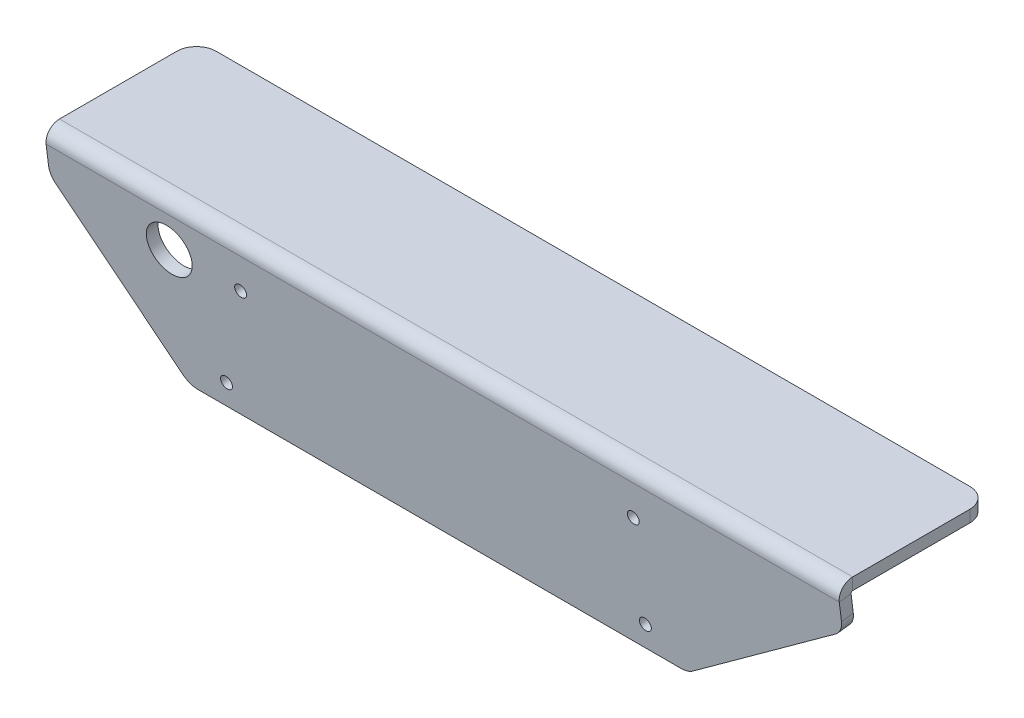
ISO-10303-21;
HEADER;
FILE_DESCRIPTION(('STEP AP214'),'2;1');
FILE_NAME('part.step','',(''),(''),'','','');
FILE_SCHEMA(('AUTOMOTIVE_DESIGN { 1 0 10303 214 1 1 1 1 }'));
ENDSEC;
DATA;
#1=APPLICATION_CONTEXT('core data for automotive mechanical design processes');
#2=APPLICATION_PROTOCOL_DEFINITION('international standard','automotive_design',2000,#1);
#3=PRODUCT_CONTEXT('',#1,'mechanical');
#4=PRODUCT('Part','Part','',(#3));
#5=PRODUCT_RELATED_PRODUCT_CATEGORY('part','',(#4));
#6=PRODUCT_DEFINITION_FORMATION('','',#4);
#7=PRODUCT_DEFINITION_CONTEXT('part definition',#1,'design');
#8=PRODUCT_DEFINITION('design','',#6,#7);
#9=PRODUCT_DEFINITION_SHAPE('','',#8);
#10=(LENGTH_UNIT() NAMED_UNIT(*) SI_UNIT(.MILLI.,.METRE.));
#11=(NAMED_UNIT(*) PLANE_ANGLE_UNIT() SI_UNIT($,.RADIAN.));
#12=(NAMED_UNIT(*) SI_UNIT($,.STERADIAN.) SOLID_ANGLE_UNIT());
#13=UNCERTAINTY_MEASURE_WITH_UNIT(LENGTH_MEASURE(1.E-05),#10,'distance_accuracy_value','');
#14=(GEOMETRIC_REPRESENTATION_CONTEXT(3) GLOBAL_UNCERTAINTY_ASSIGNED_CONTEXT((#13)) GLOBAL_UNIT_ASSIGNED_CONTEXT((#10,
#11,#12)) REPRESENTATION_CONTEXT('',''));
#15=CARTESIAN_POINT('',(0.,0.,0.));
#16=DIRECTION('',(0.,0.,1.));
#17=DIRECTION('',(1.,0.,0.));
#18=AXIS2_PLACEMENT_3D('',#15,#16,#17);
#19=CARTESIAN_POINT('',(0.,50.,40.));
#20=DIRECTION('',(1.,0.,0.));
#21=DIRECTION('',(0.,0.,-1.));
#22=AXIS2_PLACEMENT_3D('',#19,#20,#21);
#23=PLANE('',#22);
#24=DIRECTION('',(0.,-1.,0.));
#25=VECTOR('',#24,1.);
#26=CARTESIAN_POINT('',(0.,50.,39.0957644909106));
#27=LINE('',#26,#25);
#28=CARTESIAN_POINT('',(0.,56.,39.0957644909106));
#29=VERTEX_POINT('',#28);
#30=CARTESIAN_POINT('',(0.,50.,39.0957644909106));
#31=VERTEX_POINT('',#30);
#32=EDGE_CURVE('E11',#29,#31,#27,.T.);
#33=ORIENTED_EDGE('',*,*,#32,.F.);
#34=DIRECTION('',(0.,0.,1.));
#35=VECTOR('',#34,1.);
#36=CARTESIAN_POINT('',(0.,56.,40.));
#37=LINE('',#36,#35);
#38=CARTESIAN_POINT('',(0.,56.,-20.));
#39=VERTEX_POINT('',#38);
#40=EDGE_CURVE('E108',#29,#39,#37,.F.);
#41=ORIENTED_EDGE('',*,*,#40,.T.);
#42=DIRECTION('',(0.,-1.,0.));
#43=VECTOR('',#42,1.);
#44=CARTESIAN_POINT('',(0.,50.,-20.));
#45=LINE('',#44,#43);
#46=CARTESIAN_POINT('',(0.,50.,-20.));
#47=VERTEX_POINT('',#46);
#48=EDGE_CURVE('E45',#39,#47,#45,.T.);
#49=ORIENTED_EDGE('',*,*,#48,.T.);
#50=DIRECTION('',(0.,0.,-1.));
#51=VECTOR('',#50,1.);
#52=CARTESIAN_POINT('',(0.,50.,40.));
#53=LINE('',#52,#51);
#54=EDGE_CURVE('E110',#31,#47,#53,.T.);
#55=ORIENTED_EDGE('',*,*,#54,.F.);
#56=EDGE_LOOP('',(#33,#41,#49,#55));
#57=FACE_BOUND('',#56,.T.);
#58=ADVANCED_FACE('F35',(#57),#23,.F.);
#59=CARTESIAN_POINT('',(10.,50.,-20.));
#60=DIRECTION('',(0.,1.,0.));
#61=DIRECTION('',(0.,0.,1.));
#62=AXIS2_PLACEMENT_3D('',#59,#60,#61);
#63=CYLINDRICAL_SURFACE('',#62,10.);
#64=ORIENTED_EDGE('',*,*,#48,.F.);
#65=CARTESIAN_POINT('',(10.,56.,-20.));
#66=DIRECTION('',(0.,1.,0.));
#67=DIRECTION('',(0.,0.,1.));
#68=AXIS2_PLACEMENT_3D('',#65,#66,#67);
#69=CIRCLE('',#68,10.);
#70=CARTESIAN_POINT('',(10.,56.,-30.));
#71=VERTEX_POINT('',#70);
#72=EDGE_CURVE('E135',#39,#71,#69,.F.);
#73=ORIENTED_EDGE('',*,*,#72,.T.);
#74=DIRECTION('',(0.,-1.,0.));
#75=VECTOR('',#74,1.);
#76=CARTESIAN_POINT('',(10.,50.,-30.));
#77=LINE('',#76,#75);
#78=CARTESIAN_POINT('',(10.,50.,-30.));
#79=VERTEX_POINT('',#78);
#80=EDGE_CURVE('E179',#71,#79,#77,.T.);
#81=ORIENTED_EDGE('',*,*,#80,.T.);
#82=CARTESIAN_POINT('',(10.,50.,-20.));
#83=DIRECTION('',(0.,1.,0.));
#84=DIRECTION('',(0.,0.,1.));
#85=AXIS2_PLACEMENT_3D('',#82,#83,#84);
#86=CIRCLE('',#85,10.);
#87=EDGE_CURVE('E193',#47,#79,#86,.F.);
#88=ORIENTED_EDGE('',*,*,#87,.F.);
#89=EDGE_LOOP('',(#64,#73,#81,#88));
#90=FACE_BOUND('',#89,.T.);
#91=ADVANCED_FACE('F199',(#90),#63,.T.);
#92=CARTESIAN_POINT('',(400.,50.,-30.));
#93=DIRECTION('',(0.,0.,-1.));
#94=DIRECTION('',(-1.,0.,0.));
#95=AXIS2_PLACEMENT_3D('',#92,#93,#94);
#96=PLANE('',#95);
#97=ORIENTED_EDGE('',*,*,#80,.F.);
#98=DIRECTION('',(1.,0.,0.));
#99=VECTOR('',#98,1.);
#100=CARTESIAN_POINT('',(400.,56.,-30.));
#101=LINE('',#100,#99);
#102=CARTESIAN_POINT('',(390.,56.,-30.));
#103=VERTEX_POINT('',#102);
#104=EDGE_CURVE('E140',#103,#71,#101,.F.);
#105=ORIENTED_EDGE('',*,*,#104,.F.);
#106=DIRECTION('',(0.,-1.,0.));
#107=VECTOR('',#106,1.);
#108=CARTESIAN_POINT('',(390.,50.,-30.));
#109=LINE('',#108,#107);
#110=CARTESIAN_POINT('',(390.,50.,-30.));
#111=VERTEX_POINT('',#110);
#112=EDGE_CURVE('E176',#103,#111,#109,.T.);
#113=ORIENTED_EDGE('',*,*,#112,.T.);
#114=DIRECTION('',(-1.,0.,0.));
#115=VECTOR('',#114,1.);
#116=CARTESIAN_POINT('',(400.,50.,-30.));
#117=LINE('',#116,#115);
#118=EDGE_CURVE('E254',#111,#79,#117,.T.);
#119=ORIENTED_EDGE('',*,*,#118,.T.);
#120=EDGE_LOOP('',(#97,#105,#113,#119));
#121=FACE_BOUND('',#120,.T.);
#122=ADVANCED_FACE('F303',(#121),#96,.T.);
#123=CARTESIAN_POINT('',(390.,50.,-20.));
#124=DIRECTION('',(0.,1.,0.));
#125=DIRECTION('',(0.,0.,1.));
#126=AXIS2_PLACEMENT_3D('',#123,#124,#125);
#127=CYLINDRICAL_SURFACE('',#126,10.);
#128=ORIENTED_EDGE('',*,*,#112,.F.);
#129=CARTESIAN_POINT('',(390.,56.,-20.));
#130=DIRECTION('',(0.,1.,0.));
#131=DIRECTION('',(0.,0.,1.));
#132=AXIS2_PLACEMENT_3D('',#129,#130,#131);
#133=CIRCLE('',#132,10.);
#134=CARTESIAN_POINT('',(400.,56.,-20.));
#135=VERTEX_POINT('',#134);
#136=EDGE_CURVE('E297',#103,#135,#133,.F.);
#137=ORIENTED_EDGE('',*,*,#136,.T.);
#138=DIRECTION('',(0.,-1.,0.));
#139=VECTOR('',#138,1.);
#140=CARTESIAN_POINT('',(400.,50.,-20.));
#141=LINE('',#140,#139);
#142=CARTESIAN_POINT('',(400.,50.,-20.));
#143=VERTEX_POINT('',#142);
#144=EDGE_CURVE('E173',#135,#143,#141,.T.);
#145=ORIENTED_EDGE('',*,*,#144,.T.);
#146=CARTESIAN_POINT('',(390.,50.,-20.));
#147=DIRECTION('',(0.,1.,0.));
#148=DIRECTION('',(0.,0.,1.));
#149=AXIS2_PLACEMENT_3D('',#146,#147,#148);
#150=CIRCLE('',#149,10.);
#151=EDGE_CURVE('E309',#111,#143,#150,.F.);
#152=ORIENTED_EDGE('',*,*,#151,.F.);
#153=EDGE_LOOP('',(#128,#137,#145,#152));
#154=FACE_BOUND('',#153,.T.);
#155=ADVANCED_FACE('F395',(#154),#127,.T.);
#156=CARTESIAN_POINT('',(400.,50.,40.));
#157=DIRECTION('',(1.,0.,0.));
#158=DIRECTION('',(0.,0.,-1.));
#159=AXIS2_PLACEMENT_3D('',#156,#157,#158);
#160=PLANE('',#159);
#161=ORIENTED_EDGE('',*,*,#144,.F.);
#162=DIRECTION('',(0.,0.,1.));
#163=VECTOR('',#162,1.);
#164=CARTESIAN_POINT('',(400.,56.,40.));
#165=LINE('',#164,#163);
#166=CARTESIAN_POINT('',(400.,56.,39.0957644909106));
#167=VERTEX_POINT('',#166);
#168=EDGE_CURVE('E136',#167,#135,#165,.F.);
#169=ORIENTED_EDGE('',*,*,#168,.F.);
#170=DIRECTION('',(0.,-1.,0.));
#171=VECTOR('',#170,1.);
#172=CARTESIAN_POINT('',(400.,50.,39.0957644909106));
#173=LINE('',#172,#171);
#174=CARTESIAN_POINT('',(400.,50.,39.0957644909106));
#175=VERTEX_POINT('',#174);
#176=EDGE_CURVE('E170',#167,#175,#173,.T.);
#177=ORIENTED_EDGE('',*,*,#176,.T.);
#178=DIRECTION('',(0.,0.,-1.));
#179=VECTOR('',#178,1.);
#180=CARTESIAN_POINT('',(400.,50.,40.));
#181=LINE('',#180,#179);
#182=EDGE_CURVE('E197',#175,#143,#181,.T.);
#183=ORIENTED_EDGE('',*,*,#182,.T.);
#184=EDGE_LOOP('',(#161,#169,#177,#183));
#185=FACE_BOUND('',#184,.T.);
#186=ADVANCED_FACE('F314',(#185),#160,.T.);
#187=CARTESIAN_POINT('',(400.,49.2,39.0957644909106));
#188=DIRECTION('',(1.,0.,0.));
#189=DIRECTION('',(0.,0.,-1.));
#190=AXIS2_PLACEMENT_3D('',#187,#188,#189);
#191=PLANE('',#190);
#192=ORIENTED_EDGE('',*,*,#176,.F.);
#193=CARTESIAN_POINT('',(400.,49.2,39.0957644909106));
#194=DIRECTION('',(1.,0.,0.));
#195=DIRECTION('',(0.,0.,-1.));
#196=AXIS2_PLACEMENT_3D('',#193,#194,#195);
#197=CIRCLE('',#196,6.8);
#198=CARTESIAN_POINT('',(400.,48.3712884648451,45.8450783220716));
#199=VERTEX_POINT('',#198);
#200=EDGE_CURVE('E124',#167,#199,#197,.T.);
#201=ORIENTED_EDGE('',*,*,#200,.T.);
#202=DIRECTION('',(0.,0.121869343405152,-0.992546151641322));
#203=VECTOR('',#202,1.);
#204=CARTESIAN_POINT('',(400.,49.1025045252759,39.8898014122237));
#205=LINE('',#204,#203);
#206=CARTESIAN_POINT('',(400.,49.1025045252759,39.8898014122237));
#207=VERTEX_POINT('',#206);
#208=EDGE_CURVE('E168',#199,#207,#205,.T.);
#209=ORIENTED_EDGE('',*,*,#208,.T.);
#210=CARTESIAN_POINT('',(400.,49.2,39.0957644909106));
#211=DIRECTION('',(-1.,0.,0.));
#212=DIRECTION('',(0.,0.,1.));
#213=AXIS2_PLACEMENT_3D('',#210,#211,#212);
#214=CIRCLE('',#213,0.8);
#215=EDGE_CURVE('E251',#175,#207,#214,.F.);
#216=ORIENTED_EDGE('',*,*,#215,.F.);
#217=EDGE_LOOP('',(#192,#201,#209,#216));
#218=FACE_BOUND('',#217,.T.);
#219=ADVANCED_FACE('F321',(#218),#191,.T.);
#220=CARTESIAN_POINT('',(400.,-29.4036921313057,30.2504525275879));
#221=DIRECTION('',(1.,0.,0.));
#222=DIRECTION('',(0.,0.992546151641322,0.121869343405152));
#223=AXIS2_PLACEMENT_3D('',#220,#221,#222);
#224=PLANE('',#223);
#225=ORIENTED_EDGE('',*,*,#208,.F.);
#226=DIRECTION('',(0.,-0.992546151641322,-0.121869343405152));
#227=VECTOR('',#226,1.);
#228=CARTESIAN_POINT('',(400.,-30.1349081917366,36.2057294374358));
#229=LINE('',#228,#227);
#230=CARTESIAN_POINT('',(400.,39.3203256034525,44.733759821387));
#231=VERTEX_POINT('',#230);
#232=EDGE_CURVE('E271',#231,#199,#229,.F.);
#233=ORIENTED_EDGE('',*,*,#232,.F.);
#234=DIRECTION('',(0.,0.121869343405152,-0.992546151641322));
#235=VECTOR('',#234,1.);
#236=CARTESIAN_POINT('',(400.,40.0515416638834,38.7784829115391));
#237=LINE('',#236,#235);
#238=CARTESIAN_POINT('',(400.,40.0515416638834,38.7784829115391));
#239=VERTEX_POINT('',#238);
#240=EDGE_CURVE('E165',#231,#239,#237,.T.);
#241=ORIENTED_EDGE('',*,*,#240,.T.);
#242=DIRECTION('',(0.,0.992546151641322,0.121869343405152));
#243=VECTOR('',#242,1.);
#244=CARTESIAN_POINT('',(400.,-29.4036921313057,30.2504525275879));
#245=LINE('',#244,#243);
#246=EDGE_CURVE('E218',#239,#207,#245,.T.);
#247=ORIENTED_EDGE('',*,*,#246,.T.);
#248=EDGE_LOOP('',(#225,#233,#241,#247));
#249=FACE_BOUND('',#248,.T.);
#250=ADVANCED_FACE('F348',(#249),#224,.T.);
#251=CARTESIAN_POINT('',(390.,40.0515416638834,38.7784829115391));
#252=DIRECTION('',(0.,-0.121869343405152,0.992546151641322));
#253=DIRECTION('',(0.,-0.992546151641322,-0.121869343405152));
#254=AXIS2_PLACEMENT_3D('',#251,#252,#253);
#255=CYLINDRICAL_SURFACE('',#254,10.);
#256=ORIENTED_EDGE('',*,*,#240,.F.);
#257=CARTESIAN_POINT('',(390.,39.3203256034525,44.733759821387));
#258=DIRECTION('',(0.,-0.121869343405152,0.992546151641322));
#259=DIRECTION('',(0.,-0.992546151641322,-0.121869343405152));
#260=AXIS2_PLACEMENT_3D('',#257,#258,#259);
#261=CIRCLE('',#260,10.);
#262=CARTESIAN_POINT('',(396.029643092084,31.4021084030464,43.7615249993013));
#263=VERTEX_POINT('',#262);
#264=EDGE_CURVE('E291',#231,#263,#261,.F.);
#265=ORIENTED_EDGE('',*,*,#264,.T.);
#266=DIRECTION('',(0.,0.121869343405152,-0.992546151641322));
#267=VECTOR('',#266,1.);
#268=CARTESIAN_POINT('',(396.029643092084,32.1333244634773,37.8062480894533));
#269=LINE('',#268,#267);
#270=CARTESIAN_POINT('',(396.029643092084,32.1333244634773,37.8062480894533));
#271=VERTEX_POINT('',#270);
#272=EDGE_CURVE('E162',#263,#271,#269,.T.);
#273=ORIENTED_EDGE('',*,*,#272,.T.);
#274=CARTESIAN_POINT('',(390.,40.0515416638834,38.7784829115391));
#275=DIRECTION('',(0.,-0.121869343405152,0.992546151641322));
#276=DIRECTION('',(0.,-0.992546151641322,-0.121869343405152));
#277=AXIS2_PLACEMENT_3D('',#274,#275,#276);
#278=CIRCLE('',#277,10.);
#279=EDGE_CURVE('E221',#239,#271,#278,.F.);
#280=ORIENTED_EDGE('',*,*,#279,.F.);
#281=EDGE_LOOP('',(#256,#265,#273,#280));
#282=FACE_BOUND('',#281,.T.);
#283=ADVANCED_FACE('F353',(#282),#255,.T.);
#284=CARTESIAN_POINT('',(368.733327596592,11.6561682025768,35.2919694494184));
#285=DIRECTION('',(-0.602964309208396,0.791821720040617,0.0972234822085731));
#286=DIRECTION('',(-0.797768162952647,-0.598469904681862,-0.073482864459968));
#287=AXIS2_PLACEMENT_3D('',#284,#285,#286);
#288=PLANE('',#287);
#289=ORIENTED_EDGE('',*,*,#272,.F.);
#290=DIRECTION('',(-0.797768162952647,-0.598469904681862,-0.073482864459968));
#291=VECTOR('',#290,1.);
#292=CARTESIAN_POINT('',(368.733327596592,10.9249521421459,41.2472463592664));
#293=LINE('',#292,#291);
#294=CARTESIAN_POINT('',(316.675682767088,-28.1276638757296,36.4521880494016));
#295=VERTEX_POINT('',#294);
#296=EDGE_CURVE('E288',#263,#295,#293,.T.);
#297=ORIENTED_EDGE('',*,*,#296,.T.);
#298=DIRECTION('',(0.,0.121869343405152,-0.992546151641322));
#299=VECTOR('',#298,1.);
#300=CARTESIAN_POINT('',(316.675682767088,-27.3964478152987,30.4969111395537));
#301=LINE('',#300,#299);
#302=CARTESIAN_POINT('',(316.675682767088,-27.3964478152987,30.4969111395537));
#303=VERTEX_POINT('',#302);
#304=EDGE_CURVE('E159',#295,#303,#301,.T.);
#305=ORIENTED_EDGE('',*,*,#304,.T.);
#306=DIRECTION('',(-0.797768162952647,-0.598469904681862,-0.073482864459968));
#307=VECTOR('',#306,1.);
#308=CARTESIAN_POINT('',(368.733327596592,11.6561682025768,35.2919694494184));
#309=LINE('',#308,#307);
#310=EDGE_CURVE('E224',#271,#303,#309,.T.);
#311=ORIENTED_EDGE('',*,*,#310,.F.);
#312=EDGE_LOOP('',(#289,#297,#305,#311));
#313=FACE_BOUND('',#312,.T.);
#314=ADVANCED_FACE('F356',(#313),#288,.F.);
#315=CARTESIAN_POINT('',(310.646039675004,-19.4782306148925,31.4691459616394));
#316=DIRECTION('',(0.,-0.121869343405152,0.992546151641322));
#317=DIRECTION('',(0.,-0.992546151641322,-0.121869343405152));
#318=AXIS2_PLACEMENT_3D('',#315,#316,#317);
#319=CYLINDRICAL_SURFACE('',#318,10.);
#320=ORIENTED_EDGE('',*,*,#304,.F.);
#321=CARTESIAN_POINT('',(310.646039675004,-20.2094466753234,37.4244228714873));
#322=DIRECTION('',(0.,-0.121869343405152,0.992546151641322));
#323=DIRECTION('',(0.,-0.992546151641322,-0.121869343405152));
#324=AXIS2_PLACEMENT_3D('',#321,#322,#323);
#325=CIRCLE('',#324,10.);
#326=CARTESIAN_POINT('',(310.646039675004,-30.1349081917366,36.2057294374358));
#327=VERTEX_POINT('',#326);
#328=EDGE_CURVE('E285',#295,#327,#325,.F.);
#329=ORIENTED_EDGE('',*,*,#328,.T.);
#330=DIRECTION('',(0.,0.121869343405152,-0.992546151641322));
#331=VECTOR('',#330,1.);
#332=CARTESIAN_POINT('',(310.646039675004,-29.4036921313057,30.2504525275879));
#333=LINE('',#332,#331);
#334=CARTESIAN_POINT('',(310.646039675004,-29.4036921313057,30.2504525275879));
#335=VERTEX_POINT('',#334);
#336=EDGE_CURVE('E156',#327,#335,#333,.T.);
#337=ORIENTED_EDGE('',*,*,#336,.T.);
#338=CARTESIAN_POINT('',(310.646039675004,-19.4782306148925,31.4691459616394));
#339=DIRECTION('',(0.,-0.121869343405152,0.992546151641322));
#340=DIRECTION('',(0.,-0.992546151641322,-0.121869343405152));
#341=AXIS2_PLACEMENT_3D('',#338,#339,#340);
#342=CIRCLE('',#341,10.);
#343=EDGE_CURVE('E227',#303,#335,#342,.F.);
#344=ORIENTED_EDGE('',*,*,#343,.F.);
#345=EDGE_LOOP('',(#320,#329,#337,#344));
#346=FACE_BOUND('',#345,.T.);
#347=ADVANCED_FACE('F364',(#346),#319,.T.);
#348=CARTESIAN_POINT('',(400.,-29.4036921313057,30.2504525275879));
#349=DIRECTION('',(0.,0.992546151641322,0.121869343405152));
#350=DIRECTION('',(-1.,0.,0.));
#351=AXIS2_PLACEMENT_3D('',#348,#349,#350);
#352=PLANE('',#351);
#353=ORIENTED_EDGE('',*,*,#336,.F.);
#354=DIRECTION('',(1.,0.,0.));
#355=VECTOR('',#354,1.);
#356=CARTESIAN_POINT('',(400.,-30.1349081917366,36.2057294374358));
#357=LINE('',#356,#355);
#358=CARTESIAN_POINT('',(67.0337980422617,-30.1349081917366,36.2057294374358));
#359=VERTEX_POINT('',#358);
#360=EDGE_CURVE('E282',#327,#359,#357,.F.);
#361=ORIENTED_EDGE('',*,*,#360,.T.);
#362=DIRECTION('',(0.,0.121869343405152,-0.992546151641322));
#363=VECTOR('',#362,1.);
#364=CARTESIAN_POINT('',(67.0337980422617,-29.4036921313057,30.2504525275879));
#365=LINE('',#364,#363);
#366=CARTESIAN_POINT('',(67.0337980422617,-29.4036921313057,30.2504525275879));
#367=VERTEX_POINT('',#366);
#368=EDGE_CURVE('E153',#359,#367,#365,.T.);
#369=ORIENTED_EDGE('',*,*,#368,.T.);
#370=DIRECTION('',(-1.,0.,0.));
#371=VECTOR('',#370,1.);
#372=CARTESIAN_POINT('',(400.,-29.4036921313057,30.2504525275879));
#373=LINE('',#372,#371);
#374=EDGE_CURVE('E230',#335,#367,#373,.T.);
#375=ORIENTED_EDGE('',*,*,#374,.F.);
#376=EDGE_LOOP('',(#353,#361,#369,#375));
#377=FACE_BOUND('',#376,.T.);
#378=ADVANCED_FACE('F369',(#377),#352,.F.);
#379=CARTESIAN_POINT('',(67.0337980422617,-19.4782306148925,31.4691459616394));
#380=DIRECTION('',(0.,-0.121869343405152,0.992546151641322));
#381=DIRECTION('',(0.,-0.992546151641322,-0.121869343405152));
#382=AXIS2_PLACEMENT_3D('',#379,#380,#381);
#383=CYLINDRICAL_SURFACE('',#382,10.);
#384=ORIENTED_EDGE('',*,*,#368,.F.);
#385=CARTESIAN_POINT('',(67.0337980422617,-20.2094466753234,37.4244228714873));
#386=DIRECTION('',(0.,-0.121869343405152,0.992546151641322));
#387=DIRECTION('',(0.,-0.992546151641322,-0.121869343405152));
#388=AXIS2_PLACEMENT_3D('',#385,#386,#387);
#389=CIRCLE('',#388,10.);
#390=CARTESIAN_POINT('',(59.8415186596037,-27.1054011445351,36.5777061299787));
#391=VERTEX_POINT('',#390);
#392=EDGE_CURVE('E279',#359,#391,#389,.F.);
#393=ORIENTED_EDGE('',*,*,#392,.T.);
#394=DIRECTION('',(0.,0.121869343405152,-0.992546151641322));
#395=VECTOR('',#394,1.);
#396=CARTESIAN_POINT('',(59.8415186596037,-26.3741850841042,30.6224292201308));
#397=LINE('',#396,#395);
#398=CARTESIAN_POINT('',(59.8415186596037,-26.3741850841042,30.6224292201308));
#399=VERTEX_POINT('',#398);
#400=EDGE_CURVE('E150',#391,#399,#397,.T.);
#401=ORIENTED_EDGE('',*,*,#400,.T.);
#402=CARTESIAN_POINT('',(67.0337980422617,-19.4782306148925,31.4691459616394));
#403=DIRECTION('',(0.,-0.121869343405152,0.992546151641322));
#404=DIRECTION('',(0.,-0.992546151641322,-0.121869343405152));
#405=AXIS2_PLACEMENT_3D('',#402,#403,#404);
#406=CIRCLE('',#405,10.);
#407=EDGE_CURVE('E233',#367,#399,#406,.F.);
#408=ORIENTED_EDGE('',*,*,#407,.F.);
#409=EDGE_LOOP('',(#384,#393,#401,#408));
#410=FACE_BOUND('',#409,.T.);
#411=ADVANCED_FACE('F371',(#410),#383,.T.);
#412=CARTESIAN_POINT('',(225.565034585931,-196.651864141191,9.71495916554002));
#413=DIRECTION('',(0.719227938265804,0.689595446921172,0.0846716741508612));
#414=DIRECTION('',(-0.694774188364767,0.713866922278646,0.0876518365950944));
#415=AXIS2_PLACEMENT_3D('',#412,#413,#414);
#416=PLANE('',#415);
#417=ORIENTED_EDGE('',*,*,#400,.F.);
#418=DIRECTION('',(-0.694774188364767,0.713866922278646,0.0876518365950944));
#419=VECTOR('',#418,1.);
#420=CARTESIAN_POINT('',(225.565034585931,-197.383080201622,15.670236075388));
#421=LINE('',#420,#419);
#422=CARTESIAN_POINT('',(2.80772061734197,31.4957135141969,43.7730182617722));
#423=VERTEX_POINT('',#422);
#424=EDGE_CURVE('E276',#391,#423,#421,.T.);
#425=ORIENTED_EDGE('',*,*,#424,.T.);
#426=DIRECTION('',(0.,0.121869343405152,-0.992546151641322));
#427=VECTOR('',#426,1.);
#428=CARTESIAN_POINT('',(2.80772061734197,32.2269295746278,37.8177413519242));
#429=LINE('',#428,#427);
#430=CARTESIAN_POINT('',(2.80772061734197,32.2269295746278,37.8177413519242));
#431=VERTEX_POINT('',#430);
#432=EDGE_CURVE('E147',#423,#431,#429,.T.);
#433=ORIENTED_EDGE('',*,*,#432,.T.);
#434=DIRECTION('',(-0.694774188364767,0.713866922278646,0.0876518365950944));
#435=VECTOR('',#434,1.);
#436=CARTESIAN_POINT('',(225.565034585931,-196.651864141191,9.71495916554002));
#437=LINE('',#436,#435);
#438=EDGE_CURVE('E236',#399,#431,#437,.T.);
#439=ORIENTED_EDGE('',*,*,#438,.F.);
#440=EDGE_LOOP('',(#417,#425,#433,#439));
#441=FACE_BOUND('',#440,.T.);
#442=ADVANCED_FACE('F375',(#441),#416,.F.);
#443=CARTESIAN_POINT('',(10.,39.1228840438396,38.6644580934328));
#444=DIRECTION('',(0.,-0.121869343405152,0.992546151641322));
#445=DIRECTION('',(0.,-0.992546151641322,-0.121869343405152));
#446=AXIS2_PLACEMENT_3D('',#443,#444,#445);
#447=CYLINDRICAL_SURFACE('',#446,10.);
#448=ORIENTED_EDGE('',*,*,#432,.F.);
#449=CARTESIAN_POINT('',(10.,38.3916679834087,44.6197350032808));
#450=DIRECTION('',(0.,-0.121869343405152,0.992546151641322));
#451=DIRECTION('',(0.,-0.992546151641322,-0.121869343405152));
#452=AXIS2_PLACEMENT_3D('',#449,#450,#451);
#453=CIRCLE('',#452,10.);
#454=CARTESIAN_POINT('',(0.,38.3916679834087,44.6197350032808));
#455=VERTEX_POINT('',#454);
#456=EDGE_CURVE('E273',#423,#455,#453,.F.);
#457=ORIENTED_EDGE('',*,*,#456,.T.);
#458=DIRECTION('',(0.,0.121869343405152,-0.992546151641322));
#459=VECTOR('',#458,1.);
#460=CARTESIAN_POINT('',(0.,39.1228840438396,38.6644580934328));
#461=LINE('',#460,#459);
#462=CARTESIAN_POINT('',(0.,39.1228840438396,38.6644580934328));
#463=VERTEX_POINT('',#462);
#464=EDGE_CURVE('E144',#455,#463,#461,.T.);
#465=ORIENTED_EDGE('',*,*,#464,.T.);
#466=CARTESIAN_POINT('',(10.,39.1228840438396,38.6644580934328));
#467=DIRECTION('',(0.,-0.121869343405152,0.992546151641322));
#468=DIRECTION('',(0.,-0.992546151641322,-0.121869343405152));
#469=AXIS2_PLACEMENT_3D('',#466,#467,#468);
#470=CIRCLE('',#469,10.);
#471=EDGE_CURVE('E239',#431,#463,#470,.F.);
#472=ORIENTED_EDGE('',*,*,#471,.F.);
#473=EDGE_LOOP('',(#448,#457,#465,#472));
#474=FACE_BOUND('',#473,.T.);
#475=ADVANCED_FACE('F377',(#474),#447,.T.);
#476=CARTESIAN_POINT('',(0.,-29.4036921313057,30.2504525275879));
#477=DIRECTION('',(1.,0.,0.));
#478=DIRECTION('',(0.,0.992546151641322,0.121869343405152));
#479=AXIS2_PLACEMENT_3D('',#476,#477,#478);
#480=PLANE('',#479);
#481=ORIENTED_EDGE('',*,*,#464,.F.);
#482=DIRECTION('',(0.,-0.992546151641322,-0.121869343405152));
#483=VECTOR('',#482,1.);
#484=CARTESIAN_POINT('',(0.,-30.1349081917366,36.2057294374358));
#485=LINE('',#484,#483);
#486=CARTESIAN_POINT('',(0.,48.371288464845,45.8450783220716));
#487=VERTEX_POINT('',#486);
#488=EDGE_CURVE('E129',#455,#487,#485,.F.);
#489=ORIENTED_EDGE('',*,*,#488,.T.);
#490=DIRECTION('',(0.,0.121869343405129,-0.992546151641324));
#491=VECTOR('',#490,1.);
#492=CARTESIAN_POINT('',(0.,49.1025045252759,39.8898014122237));
#493=LINE('',#492,#491);
#494=CARTESIAN_POINT('',(0.,49.1025045252759,39.8898014122237));
#495=VERTEX_POINT('',#494);
#496=EDGE_CURVE('E39',#487,#495,#493,.T.);
#497=ORIENTED_EDGE('',*,*,#496,.T.);
#498=DIRECTION('',(0.,0.992546151641322,0.121869343405152));
#499=VECTOR('',#498,1.);
#500=CARTESIAN_POINT('',(0.,-29.4036921313057,30.2504525275879));
#501=LINE('',#500,#499);
#502=EDGE_CURVE('E242',#463,#495,#501,.T.);
#503=ORIENTED_EDGE('',*,*,#502,.F.);
#504=EDGE_LOOP('',(#481,#489,#497,#503));
#505=FACE_BOUND('',#504,.T.);
#506=ADVANCED_FACE('F329',(#505),#480,.F.);
#507=CARTESIAN_POINT('',(82.79,-17.7097453126682,31.6862886529363));
#508=DIRECTION('',(0.,-0.121869343405152,0.992546151641322));
#509=DIRECTION('',(0.,-0.992546151641322,-0.121869343405152));
#510=AXIS2_PLACEMENT_3D('',#507,#508,#509);
#511=CYLINDRICAL_SURFACE('',#510,3.00000000000001);
#512=CARTESIAN_POINT('',(82.79,-17.7097453126682,31.6862886529363));
#513=DIRECTION('',(0.,-0.121869343405152,0.992546151641322));
#514=DIRECTION('',(0.,-0.992546151641322,-0.121869343405152));
#515=AXIS2_PLACEMENT_3D('',#512,#513,#514);
#516=CIRCLE('',#515,3.00000000000001);
#517=CARTESIAN_POINT('',(82.79,-20.6873837675922,31.3206806227208));
#518=VERTEX_POINT('',#517);
#519=EDGE_CURVE('E200',#518,#518,#516,.T.);
#520=ORIENTED_EDGE('',*,*,#519,.F.);
#521=EDGE_LOOP('',(#520));
#522=FACE_BOUND('',#521,.T.);
#523=CARTESIAN_POINT('',(82.79,-18.4409613730991,37.6415655627842));
#524=DIRECTION('',(0.,-0.121869343405152,0.992546151641322));
#525=DIRECTION('',(0.,-0.992546151641322,-0.121869343405152));
#526=AXIS2_PLACEMENT_3D('',#523,#524,#525);
#527=CIRCLE('',#526,3.00000000000001);
#528=CARTESIAN_POINT('',(82.79,-21.4185998280231,37.2759575325687));
#529=VERTEX_POINT('',#528);
#530=EDGE_CURVE('E256',#529,#529,#527,.T.);
#531=ORIENTED_EDGE('',*,*,#530,.T.);
#532=EDGE_LOOP('',(#531));
#533=FACE_BOUND('',#532,.T.);
#534=ADVANCED_FACE('F384',(#522,#533),#511,.F.);
#535=CARTESIAN_POINT('',(60.,31.9175622693979,37.7797558231938));
#536=DIRECTION('',(0.,-0.121869343405152,0.992546151641322));
#537=DIRECTION('',(0.,-0.992546151641322,-0.121869343405152));
#538=AXIS2_PLACEMENT_3D('',#535,#536,#537);
#539=CYLINDRICAL_SURFACE('',#538,11.5);
#540=CARTESIAN_POINT('',(60.,31.9175622693979,37.7797558231938));
#541=DIRECTION('',(0.,-0.121869343405152,0.992546151641322));
#542=DIRECTION('',(0.,-0.992546151641322,-0.121869343405152));
#543=AXIS2_PLACEMENT_3D('',#540,#541,#542);
#544=CIRCLE('',#543,11.5);
#545=CARTESIAN_POINT('',(60.,20.5032815255227,36.3782583740346));
#546=VERTEX_POINT('',#545);
#547=EDGE_CURVE('E203',#546,#546,#544,.T.);
#548=ORIENTED_EDGE('',*,*,#547,.F.);
#549=EDGE_LOOP('',(#548));
#550=FACE_BOUND('',#549,.T.);
#551=CARTESIAN_POINT('',(60.,31.186346208967,43.7350327330418));
#552=DIRECTION('',(0.,-0.121869343405152,0.992546151641322));
#553=DIRECTION('',(0.,-0.992546151641322,-0.121869343405152));
#554=AXIS2_PLACEMENT_3D('',#551,#552,#553);
#555=CIRCLE('',#554,11.5);
#556=CARTESIAN_POINT('',(60.,19.7720654650918,42.3335352838825));
#557=VERTEX_POINT('',#556);
#558=EDGE_CURVE('E259',#557,#557,#555,.T.);
#559=ORIENTED_EDGE('',*,*,#558,.T.);
#560=EDGE_LOOP('',(#559));
#561=FACE_BOUND('',#560,.T.);
#562=ADVANCED_FACE('F444',(#550,#561),#539,.F.);
#563=CARTESIAN_POINT('',(294.,-17.7097453126682,31.6862886529363));
#564=DIRECTION('',(0.,-0.121869343405152,0.992546151641322));
#565=DIRECTION('',(0.,-0.992546151641322,-0.121869343405152));
#566=AXIS2_PLACEMENT_3D('',#563,#564,#565);
#567=CYLINDRICAL_SURFACE('',#566,2.99999999999999);
#568=CARTESIAN_POINT('',(294.,-17.7097453126682,31.6862886529363));
#569=DIRECTION('',(0.,-0.121869343405152,0.992546151641322));
#570=DIRECTION('',(0.,-0.992546151641322,-0.121869343405152));
#571=AXIS2_PLACEMENT_3D('',#568,#569,#570);
#572=CIRCLE('',#571,2.99999999999999);
#573=CARTESIAN_POINT('',(294.,-20.6873837675922,31.3206806227208));
#574=VERTEX_POINT('',#573);
#575=EDGE_CURVE('E209',#574,#574,#572,.T.);
#576=ORIENTED_EDGE('',*,*,#575,.F.);
#577=EDGE_LOOP('',(#576));
#578=FACE_BOUND('',#577,.T.);
#579=CARTESIAN_POINT('',(294.,-18.4409613730991,37.6415655627842));
#580=DIRECTION('',(0.,-0.121869343405152,0.992546151641322));
#581=DIRECTION('',(0.,-0.992546151641322,-0.121869343405152));
#582=AXIS2_PLACEMENT_3D('',#579,#580,#581);
#583=CIRCLE('',#582,2.99999999999999);
#584=CARTESIAN_POINT('',(294.,-21.4185998280231,37.2759575325687));
#585=VERTEX_POINT('',#584);
#586=EDGE_CURVE('E262',#585,#585,#583,.T.);
#587=ORIENTED_EDGE('',*,*,#586,.T.);
#588=EDGE_LOOP('',(#587));
#589=FACE_BOUND('',#588,.T.);
#590=ADVANCED_FACE('F455',(#578,#589),#567,.F.);
#591=CARTESIAN_POINT('',(294.,31.9175622693979,37.7797558231938));
#592=DIRECTION('',(0.,-0.121869343405152,0.992546151641322));
#593=DIRECTION('',(0.,-0.992546151641322,-0.121869343405152));
#594=AXIS2_PLACEMENT_3D('',#591,#592,#593);
#595=CYLINDRICAL_SURFACE('',#594,2.99999999999999);
#596=CARTESIAN_POINT('',(294.,31.9175622693979,37.7797558231938));
#597=DIRECTION('',(0.,-0.121869343405152,0.992546151641322));
#598=DIRECTION('',(0.,-0.992546151641322,-0.121869343405152));
#599=AXIS2_PLACEMENT_3D('',#596,#597,#598);
#600=CIRCLE('',#599,2.99999999999999);
#601=CARTESIAN_POINT('',(294.,28.9399238144739,37.4141477929784));
#602=VERTEX_POINT('',#601);
#603=EDGE_CURVE('E212',#602,#602,#600,.T.);
#604=ORIENTED_EDGE('',*,*,#603,.F.);
#605=EDGE_LOOP('',(#604));
#606=FACE_BOUND('',#605,.T.);
#607=CARTESIAN_POINT('',(294.,31.186346208967,43.7350327330418));
#608=DIRECTION('',(0.,-0.121869343405152,0.992546151641322));
#609=DIRECTION('',(0.,-0.992546151641322,-0.121869343405152));
#610=AXIS2_PLACEMENT_3D('',#607,#608,#609);
#611=CIRCLE('',#610,2.99999999999999);
#612=CARTESIAN_POINT('',(294.,28.208707754043,43.3694247028263));
#613=VERTEX_POINT('',#612);
#614=EDGE_CURVE('E265',#613,#613,#611,.T.);
#615=ORIENTED_EDGE('',*,*,#614,.T.);
#616=EDGE_LOOP('',(#615));
#617=FACE_BOUND('',#616,.T.);
#618=ADVANCED_FACE('F466',(#606,#617),#595,.F.);
#619=CARTESIAN_POINT('',(96.,31.9175622693979,37.7797558231938));
#620=DIRECTION('',(0.,-0.121869343405152,0.992546151641322));
#621=DIRECTION('',(0.,-0.992546151641322,-0.121869343405152));
#622=AXIS2_PLACEMENT_3D('',#619,#620,#621);
#623=CYLINDRICAL_SURFACE('',#622,3.00000000000001);
#624=CARTESIAN_POINT('',(96.,31.9175622693979,37.7797558231938));
#625=DIRECTION('',(0.,-0.121869343405152,0.992546151641322));
#626=DIRECTION('',(0.,-0.992546151641322,-0.121869343405152));
#627=AXIS2_PLACEMENT_3D('',#624,#625,#626);
#628=CIRCLE('',#627,3.00000000000001);
#629=CARTESIAN_POINT('',(96.,28.9399238144739,37.4141477929784));
#630=VERTEX_POINT('',#629);
#631=EDGE_CURVE('E215',#630,#630,#628,.T.);
#632=ORIENTED_EDGE('',*,*,#631,.F.);
#633=EDGE_LOOP('',(#632));
#634=FACE_BOUND('',#633,.T.);
#635=CARTESIAN_POINT('',(96.,31.186346208967,43.7350327330418));
#636=DIRECTION('',(0.,-0.121869343405152,0.992546151641322));
#637=DIRECTION('',(0.,-0.992546151641322,-0.121869343405152));
#638=AXIS2_PLACEMENT_3D('',#635,#636,#637);
#639=CIRCLE('',#638,3.00000000000001);
#640=CARTESIAN_POINT('',(96.,28.208707754043,43.3694247028263));
#641=VERTEX_POINT('',#640);
#642=EDGE_CURVE('E268',#641,#641,#639,.T.);
#643=ORIENTED_EDGE('',*,*,#642,.T.);
#644=EDGE_LOOP('',(#643));
#645=FACE_BOUND('',#644,.T.);
#646=ADVANCED_FACE('F477',(#634,#645),#623,.F.);
#647=CARTESIAN_POINT('',(0.,49.2,39.0957644909106));
#648=DIRECTION('',(-1.,0.,0.));
#649=DIRECTION('',(0.,0.,1.));
#650=AXIS2_PLACEMENT_3D('',#647,#648,#649);
#651=PLANE('',#650);
#652=CARTESIAN_POINT('',(0.,49.2,39.0957644909106));
#653=DIRECTION('',(1.,0.,0.));
#654=DIRECTION('',(0.,0.,-1.));
#655=AXIS2_PLACEMENT_3D('',#652,#653,#654);
#656=CIRCLE('',#655,6.8);
#657=EDGE_CURVE('E122',#487,#29,#656,.F.);
#658=ORIENTED_EDGE('',*,*,#657,.T.);
#659=ORIENTED_EDGE('',*,*,#32,.T.);
#660=CARTESIAN_POINT('',(0.,49.2,39.0957644909106));
#661=DIRECTION('',(1.,0.,0.));
#662=DIRECTION('',(0.,0.,-1.));
#663=AXIS2_PLACEMENT_3D('',#660,#661,#662);
#664=CIRCLE('',#663,0.8);
#665=EDGE_CURVE('E249',#495,#31,#664,.F.);
#666=ORIENTED_EDGE('',*,*,#665,.F.);
#667=ORIENTED_EDGE('',*,*,#496,.F.);
#668=EDGE_LOOP('',(#658,#659,#666,#667));
#669=FACE_BOUND('',#668,.T.);
#670=ADVANCED_FACE('F37',(#669),#651,.T.);
#671=CARTESIAN_POINT('',(400.,-29.4036921313057,30.2504525275879));
#672=DIRECTION('',(0.,-0.121869343405152,0.992546151641322));
#673=DIRECTION('',(0.,-0.992546151641322,-0.121869343405152));
#674=AXIS2_PLACEMENT_3D('',#671,#672,#673);
#675=PLANE('',#674);
#676=ORIENTED_EDGE('',*,*,#519,.T.);
#677=EDGE_LOOP('',(#676));
#678=FACE_BOUND('',#677,.T.);
#679=ORIENTED_EDGE('',*,*,#547,.T.);
#680=EDGE_LOOP('',(#679));
#681=FACE_BOUND('',#680,.T.);
#682=ORIENTED_EDGE('',*,*,#575,.T.);
#683=EDGE_LOOP('',(#682));
#684=FACE_BOUND('',#683,.T.);
#685=ORIENTED_EDGE('',*,*,#603,.T.);
#686=EDGE_LOOP('',(#685));
#687=FACE_BOUND('',#686,.T.);
#688=ORIENTED_EDGE('',*,*,#631,.T.);
#689=EDGE_LOOP('',(#688));
#690=FACE_BOUND('',#689,.T.);
#691=ORIENTED_EDGE('',*,*,#502,.T.);
#692=DIRECTION('',(-1.,0.,0.));
#693=VECTOR('',#692,1.);
#694=CARTESIAN_POINT('',(400.,49.1025045252759,39.8898014122237));
#695=LINE('',#694,#693);
#696=EDGE_CURVE('E246',#495,#207,#695,.F.);
#697=ORIENTED_EDGE('',*,*,#696,.T.);
#698=ORIENTED_EDGE('',*,*,#246,.F.);
#699=ORIENTED_EDGE('',*,*,#279,.T.);
#700=ORIENTED_EDGE('',*,*,#310,.T.);
#701=ORIENTED_EDGE('',*,*,#343,.T.);
#702=ORIENTED_EDGE('',*,*,#374,.T.);
#703=ORIENTED_EDGE('',*,*,#407,.T.);
#704=ORIENTED_EDGE('',*,*,#438,.T.);
#705=ORIENTED_EDGE('',*,*,#471,.T.);
#706=EDGE_LOOP('',(#691,#697,#698,#699,#700,#701,#702,#703,#704,#705));
#707=FACE_BOUND('',#706,.T.);
#708=ADVANCED_FACE('F326',(#678,#681,#684,#687,#690,#707),#675,.F.);
#709=CARTESIAN_POINT('',(400.,50.,40.));
#710=DIRECTION('',(0.,1.,0.));
#711=DIRECTION('',(0.,0.,1.));
#712=AXIS2_PLACEMENT_3D('',#709,#710,#711);
#713=PLANE('',#712);
#714=ORIENTED_EDGE('',*,*,#182,.F.);
#715=DIRECTION('',(-1.,0.,0.));
#716=VECTOR('',#715,1.);
#717=CARTESIAN_POINT('',(0.,50.,39.0957644909106));
#718=LINE('',#717,#716);
#719=EDGE_CURVE('E196',#175,#31,#718,.T.);
#720=ORIENTED_EDGE('',*,*,#719,.T.);
#721=ORIENTED_EDGE('',*,*,#54,.T.);
#722=ORIENTED_EDGE('',*,*,#87,.T.);
#723=ORIENTED_EDGE('',*,*,#118,.F.);
#724=ORIENTED_EDGE('',*,*,#151,.T.);
#725=EDGE_LOOP('',(#714,#720,#721,#722,#723,#724));
#726=FACE_BOUND('',#725,.T.);
#727=ADVANCED_FACE('F191',(#726),#713,.F.);
#728=CARTESIAN_POINT('',(400.,49.2,39.0957644909106));
#729=DIRECTION('',(1.,0.,0.));
#730=DIRECTION('',(0.,0.,-1.));
#731=AXIS2_PLACEMENT_3D('',#728,#729,#730);
#732=CYLINDRICAL_SURFACE('',#731,0.8);
#733=ORIENTED_EDGE('',*,*,#215,.T.);
#734=ORIENTED_EDGE('',*,*,#696,.F.);
#735=ORIENTED_EDGE('',*,*,#665,.T.);
#736=ORIENTED_EDGE('',*,*,#719,.F.);
#737=EDGE_LOOP('',(#733,#734,#735,#736));
#738=FACE_BOUND('',#737,.T.);
#739=ADVANCED_FACE('F324',(#738),#732,.F.);
#740=CARTESIAN_POINT('',(400.,-30.1349081917366,36.2057294374358));
#741=DIRECTION('',(0.,-0.121869343405152,0.992546151641322));
#742=DIRECTION('',(0.,-0.992546151641322,-0.121869343405152));
#743=AXIS2_PLACEMENT_3D('',#740,#741,#742);
#744=PLANE('',#743);
#745=ORIENTED_EDGE('',*,*,#530,.F.);
#746=EDGE_LOOP('',(#745));
#747=FACE_BOUND('',#746,.T.);
#748=ORIENTED_EDGE('',*,*,#558,.F.);
#749=EDGE_LOOP('',(#748));
#750=FACE_BOUND('',#749,.T.);
#751=ORIENTED_EDGE('',*,*,#586,.F.);
#752=EDGE_LOOP('',(#751));
#753=FACE_BOUND('',#752,.T.);
#754=ORIENTED_EDGE('',*,*,#614,.F.);
#755=EDGE_LOOP('',(#754));
#756=FACE_BOUND('',#755,.T.);
#757=ORIENTED_EDGE('',*,*,#642,.F.);
#758=EDGE_LOOP('',(#757));
#759=FACE_BOUND('',#758,.T.);
#760=ORIENTED_EDGE('',*,*,#488,.F.);
#761=ORIENTED_EDGE('',*,*,#456,.F.);
#762=ORIENTED_EDGE('',*,*,#424,.F.);
#763=ORIENTED_EDGE('',*,*,#392,.F.);
#764=ORIENTED_EDGE('',*,*,#360,.F.);
#765=ORIENTED_EDGE('',*,*,#328,.F.);
#766=ORIENTED_EDGE('',*,*,#296,.F.);
#767=ORIENTED_EDGE('',*,*,#264,.F.);
#768=ORIENTED_EDGE('',*,*,#232,.T.);
#769=DIRECTION('',(1.,0.,0.));
#770=VECTOR('',#769,1.);
#771=CARTESIAN_POINT('',(400.,48.371288464845,45.8450783220716));
#772=LINE('',#771,#770);
#773=EDGE_CURVE('E128',#487,#199,#772,.T.);
#774=ORIENTED_EDGE('',*,*,#773,.F.);
#775=EDGE_LOOP('',(#760,#761,#762,#763,#764,#765,#766,#767,#768,#774));
#776=FACE_BOUND('',#775,.T.);
#777=ADVANCED_FACE('F360',(#747,#750,#753,#756,#759,#776),#744,.T.);
#778=CARTESIAN_POINT('',(400.,56.,40.));
#779=DIRECTION('',(0.,1.,0.));
#780=DIRECTION('',(0.,0.,1.));
#781=AXIS2_PLACEMENT_3D('',#778,#779,#780);
#782=PLANE('',#781);
#783=ORIENTED_EDGE('',*,*,#168,.T.);
#784=ORIENTED_EDGE('',*,*,#136,.F.);
#785=ORIENTED_EDGE('',*,*,#104,.T.);
#786=ORIENTED_EDGE('',*,*,#72,.F.);
#787=ORIENTED_EDGE('',*,*,#40,.F.);
#788=DIRECTION('',(1.,0.,0.));
#789=VECTOR('',#788,1.);
#790=CARTESIAN_POINT('',(400.,56.,39.0957644909106));
#791=LINE('',#790,#789);
#792=EDGE_CURVE('E119',#167,#29,#791,.F.);
#793=ORIENTED_EDGE('',*,*,#792,.F.);
#794=EDGE_LOOP('',(#783,#784,#785,#786,#787,#793));
#795=FACE_BOUND('',#794,.T.);
#796=ADVANCED_FACE('F132',(#795),#782,.T.);
#797=CARTESIAN_POINT('',(400.,49.2,39.0957644909106));
#798=DIRECTION('',(1.,0.,0.));
#799=DIRECTION('',(0.,0.,-1.));
#800=AXIS2_PLACEMENT_3D('',#797,#798,#799);
#801=CYLINDRICAL_SURFACE('',#800,6.8);
#802=ORIENTED_EDGE('',*,*,#200,.F.);
#803=ORIENTED_EDGE('',*,*,#792,.T.);
#804=ORIENTED_EDGE('',*,*,#657,.F.);
#805=ORIENTED_EDGE('',*,*,#773,.T.);
#806=EDGE_LOOP('',(#802,#803,#804,#805));
#807=FACE_BOUND('',#806,.T.);
#808=ADVANCED_FACE('F120',(#807),#801,.T.);
#809=CLOSED_SHELL('',(#58,#91,#122,#155,#186,#219,#250,#283,#314,#347,#378,#411,#442,#475,#506,
#534,#562,#590,#618,#646,#670,#708,#727,#739,#777,#796,#808));
#810=MANIFOLD_SOLID_BREP('B2',#809);
#811=ADVANCED_BREP_SHAPE_REPRESENTATION('',(#18,#810),#14);
#812=SHAPE_DEFINITION_REPRESENTATION(#9,#811);
ENDSEC;
END-ISO-10303-21;
